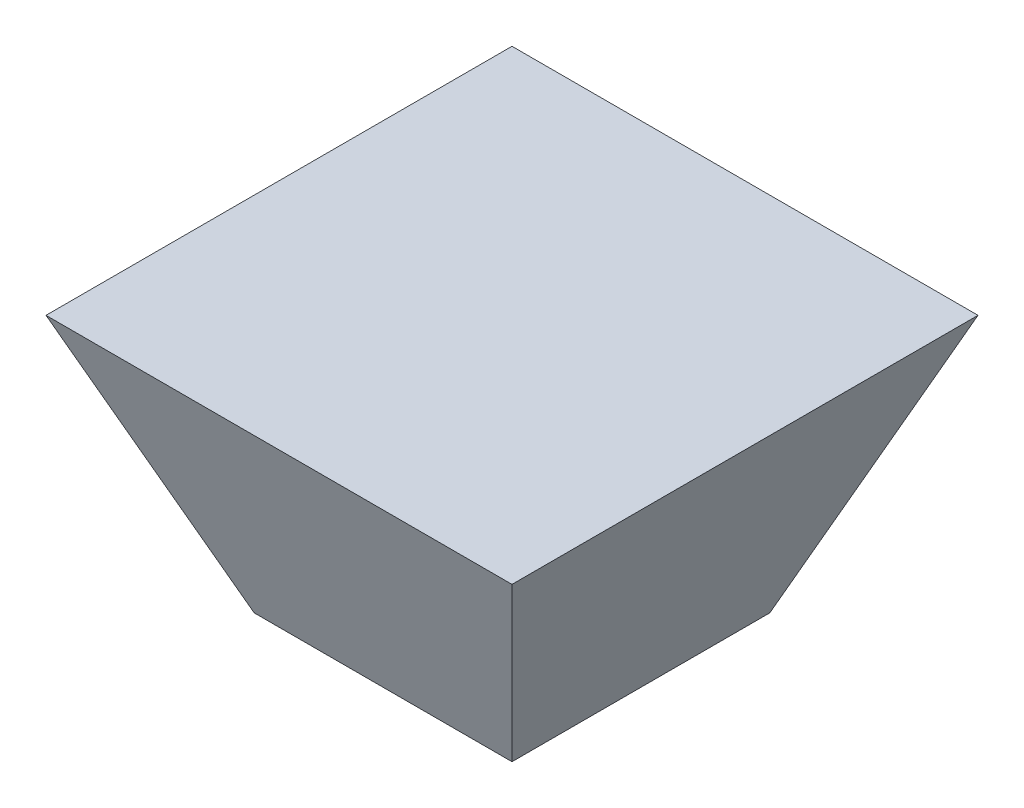
ISO-10303-21;
HEADER;
FILE_DESCRIPTION(('STEP AP214'),'2;1');
FILE_NAME('part.step','',(''),(''),'','','');
FILE_SCHEMA(('AUTOMOTIVE_DESIGN { 1 0 10303 214 1 1 1 1 }'));
ENDSEC;
DATA;
#1=APPLICATION_CONTEXT('core data for automotive mechanical design processes');
#2=APPLICATION_PROTOCOL_DEFINITION('international standard','automotive_design',2000,#1);
#3=PRODUCT_CONTEXT('',#1,'mechanical');
#4=PRODUCT('Part','Part','',(#3));
#5=PRODUCT_RELATED_PRODUCT_CATEGORY('part','',(#4));
#6=PRODUCT_DEFINITION_FORMATION('','',#4);
#7=PRODUCT_DEFINITION_CONTEXT('part definition',#1,'design');
#8=PRODUCT_DEFINITION('design','',#6,#7);
#9=PRODUCT_DEFINITION_SHAPE('','',#8);
#10=(LENGTH_UNIT() NAMED_UNIT(*) SI_UNIT(.MILLI.,.METRE.));
#11=(NAMED_UNIT(*) PLANE_ANGLE_UNIT() SI_UNIT($,.RADIAN.));
#12=(NAMED_UNIT(*) SI_UNIT($,.STERADIAN.) SOLID_ANGLE_UNIT());
#13=UNCERTAINTY_MEASURE_WITH_UNIT(LENGTH_MEASURE(1.E-05),#10,'distance_accuracy_value','');
#14=(GEOMETRIC_REPRESENTATION_CONTEXT(3) GLOBAL_UNCERTAINTY_ASSIGNED_CONTEXT((#13)) GLOBAL_UNIT_ASSIGNED_CONTEXT((#10,
#11,#12)) REPRESENTATION_CONTEXT('',''));
#15=CARTESIAN_POINT('',(0.,0.,0.));
#16=DIRECTION('',(0.,0.,1.));
#17=DIRECTION('',(1.,0.,0.));
#18=AXIS2_PLACEMENT_3D('',#15,#16,#17);
#19=CARTESIAN_POINT('',(-56.35,0.,-56.35));
#20=DIRECTION('',(-0.927183854566787,-0.374606593415913,0.));
#21=DIRECTION('',(0.374606593415913,-0.927183854566787,0.));
#22=AXIS2_PLACEMENT_3D('',#19,#20,#21);
#23=PLANE('',#22);
#24=DIRECTION('',(0.,0.,1.));
#25=VECTOR('',#24,1.);
#26=CARTESIAN_POINT('',(-56.35,0.,-56.35));
#27=LINE('',#26,#25);
#28=CARTESIAN_POINT('',(-56.35,0.,-56.35));
#29=VERTEX_POINT('',#28);
#30=CARTESIAN_POINT('',(-56.35,0.,56.35));
#31=VERTEX_POINT('',#30);
#32=EDGE_CURVE('E87',#29,#31,#27,.T.);
#33=ORIENTED_EDGE('',*,*,#32,.T.);
#34=DIRECTION('',(0.350800434887317,-0.868261544562316,-0.350800434887317));
#35=VECTOR('',#34,1.);
#36=CARTESIAN_POINT('',(-56.35,0.,56.35));
#37=LINE('',#36,#35);
#38=CARTESIAN_POINT('',(-101.883755651622,112.7,101.883755651622));
#39=VERTEX_POINT('',#38);
#40=EDGE_CURVE('E11',#39,#31,#37,.T.);
#41=ORIENTED_EDGE('',*,*,#40,.F.);
#42=DIRECTION('',(0.,0.,-1.));
#43=VECTOR('',#42,1.);
#44=CARTESIAN_POINT('',(-101.883755651622,112.7,-56.35));
#45=LINE('',#44,#43);
#46=CARTESIAN_POINT('',(-101.883755651622,112.7,-101.883755651622));
#47=VERTEX_POINT('',#46);
#48=EDGE_CURVE('E100',#47,#39,#45,.F.);
#49=ORIENTED_EDGE('',*,*,#48,.F.);
#50=DIRECTION('',(-0.350800434887317,0.868261544562316,-0.350800434887317));
#51=VECTOR('',#50,1.);
#52=CARTESIAN_POINT('',(-56.35,0.,-56.35));
#53=LINE('',#52,#51);
#54=EDGE_CURVE('E54',#47,#29,#53,.F.);
#55=ORIENTED_EDGE('',*,*,#54,.T.);
#56=EDGE_LOOP('',(#33,#41,#49,#55));
#57=FACE_BOUND('',#56,.T.);
#58=ADVANCED_FACE('F37',(#57),#23,.T.);
#59=CARTESIAN_POINT('',(-56.35,0.,56.35));
#60=DIRECTION('',(0.,-0.374606593415913,0.927183854566787));
#61=DIRECTION('',(0.,-0.927183854566787,-0.374606593415913));
#62=AXIS2_PLACEMENT_3D('',#59,#60,#61);
#63=PLANE('',#62);
#64=DIRECTION('',(1.,0.,0.));
#65=VECTOR('',#64,1.);
#66=CARTESIAN_POINT('',(-56.35,0.,56.35));
#67=LINE('',#66,#65);
#68=CARTESIAN_POINT('',(56.35,0.,56.35));
#69=VERTEX_POINT('',#68);
#70=EDGE_CURVE('E83',#31,#69,#67,.T.);
#71=ORIENTED_EDGE('',*,*,#70,.T.);
#72=DIRECTION('',(0.350800434887317,0.868261544562316,0.350800434887317));
#73=VECTOR('',#72,1.);
#74=CARTESIAN_POINT('',(42.4810314852993,-34.32690164118,42.4810314852994));
#75=LINE('',#74,#73);
#76=CARTESIAN_POINT('',(101.883755651622,112.7,101.883755651622));
#77=VERTEX_POINT('',#76);
#78=EDGE_CURVE('E46',#77,#69,#75,.F.);
#79=ORIENTED_EDGE('',*,*,#78,.F.);
#80=DIRECTION('',(-1.,0.,0.));
#81=VECTOR('',#80,1.);
#82=CARTESIAN_POINT('',(-56.35,112.7,101.883755651622));
#83=LINE('',#82,#81);
#84=EDGE_CURVE('E93',#39,#77,#83,.F.);
#85=ORIENTED_EDGE('',*,*,#84,.F.);
#86=ORIENTED_EDGE('',*,*,#40,.T.);
#87=EDGE_LOOP('',(#71,#79,#85,#86));
#88=FACE_BOUND('',#87,.T.);
#89=ADVANCED_FACE('F39',(#88),#63,.T.);
#90=CARTESIAN_POINT('',(56.35,0.,-56.35));
#91=DIRECTION('',(0.927183854566787,-0.374606593415913,0.));
#92=DIRECTION('',(0.374606593415913,0.927183854566787,0.));
#93=AXIS2_PLACEMENT_3D('',#90,#91,#92);
#94=PLANE('',#93);
#95=DIRECTION('',(0.,0.,1.));
#96=VECTOR('',#95,1.);
#97=CARTESIAN_POINT('',(56.35,0.,-56.35));
#98=LINE('',#97,#96);
#99=CARTESIAN_POINT('',(56.35,0.,-56.35));
#100=VERTEX_POINT('',#99);
#101=EDGE_CURVE('E88',#100,#69,#98,.T.);
#102=ORIENTED_EDGE('',*,*,#101,.F.);
#103=DIRECTION('',(-0.350800434887317,-0.868261544562316,0.350800434887317));
#104=VECTOR('',#103,1.);
#105=CARTESIAN_POINT('',(42.4810314852993,-34.32690164118,-42.4810314852993));
#106=LINE('',#105,#104);
#107=CARTESIAN_POINT('',(101.883755651622,112.7,-101.883755651622));
#108=VERTEX_POINT('',#107);
#109=EDGE_CURVE('E62',#108,#100,#106,.T.);
#110=ORIENTED_EDGE('',*,*,#109,.F.);
#111=DIRECTION('',(0.,0.,1.));
#112=VECTOR('',#111,1.);
#113=CARTESIAN_POINT('',(101.883755651622,112.7,-56.35));
#114=LINE('',#113,#112);
#115=EDGE_CURVE('E106',#108,#77,#114,.T.);
#116=ORIENTED_EDGE('',*,*,#115,.T.);
#117=ORIENTED_EDGE('',*,*,#78,.T.);
#118=EDGE_LOOP('',(#102,#110,#116,#117));
#119=FACE_BOUND('',#118,.T.);
#120=ADVANCED_FACE('F111',(#119),#94,.T.);
#121=CARTESIAN_POINT('',(-56.35,0.,-56.35));
#122=DIRECTION('',(0.,-0.374606593415913,-0.927183854566787));
#123=DIRECTION('',(0.,0.927183854566787,-0.374606593415913));
#124=AXIS2_PLACEMENT_3D('',#121,#122,#123);
#125=PLANE('',#124);
#126=DIRECTION('',(1.,0.,0.));
#127=VECTOR('',#126,1.);
#128=CARTESIAN_POINT('',(-56.35,0.,-56.35));
#129=LINE('',#128,#127);
#130=EDGE_CURVE('E99',#29,#100,#129,.T.);
#131=ORIENTED_EDGE('',*,*,#130,.F.);
#132=ORIENTED_EDGE('',*,*,#54,.F.);
#133=DIRECTION('',(1.,0.,0.));
#134=VECTOR('',#133,1.);
#135=CARTESIAN_POINT('',(-56.35,112.7,-101.883755651622));
#136=LINE('',#135,#134);
#137=EDGE_CURVE('E41',#47,#108,#136,.T.);
#138=ORIENTED_EDGE('',*,*,#137,.T.);
#139=ORIENTED_EDGE('',*,*,#109,.T.);
#140=EDGE_LOOP('',(#131,#132,#138,#139));
#141=FACE_BOUND('',#140,.T.);
#142=ADVANCED_FACE('F108',(#141),#125,.T.);
#143=CARTESIAN_POINT('',(0.,112.7,0.));
#144=DIRECTION('',(0.,1.,0.));
#145=DIRECTION('',(0.,0.,1.));
#146=AXIS2_PLACEMENT_3D('',#143,#144,#145);
#147=PLANE('',#146);
#148=ORIENTED_EDGE('',*,*,#48,.T.);
#149=ORIENTED_EDGE('',*,*,#84,.T.);
#150=ORIENTED_EDGE('',*,*,#115,.F.);
#151=ORIENTED_EDGE('',*,*,#137,.F.);
#152=EDGE_LOOP('',(#148,#149,#150,#151));
#153=FACE_BOUND('',#152,.T.);
#154=ADVANCED_FACE('F110',(#153),#147,.T.);
#155=CARTESIAN_POINT('',(0.,0.,0.));
#156=DIRECTION('',(0.,1.,0.));
#157=DIRECTION('',(0.,0.,1.));
#158=AXIS2_PLACEMENT_3D('',#155,#156,#157);
#159=PLANE('',#158);
#160=ORIENTED_EDGE('',*,*,#32,.F.);
#161=ORIENTED_EDGE('',*,*,#130,.T.);
#162=ORIENTED_EDGE('',*,*,#101,.T.);
#163=ORIENTED_EDGE('',*,*,#70,.F.);
#164=EDGE_LOOP('',(#160,#161,#162,#163));
#165=FACE_BOUND('',#164,.T.);
#166=ADVANCED_FACE('F84',(#165),#159,.F.);
#167=CLOSED_SHELL('',(#58,#89,#120,#142,#154,#166));
#168=MANIFOLD_SOLID_BREP('B2',#167);
#169=ADVANCED_BREP_SHAPE_REPRESENTATION('',(#18,#168),#14);
#170=SHAPE_DEFINITION_REPRESENTATION(#9,#169);
ENDSEC;
END-ISO-10303-21;
